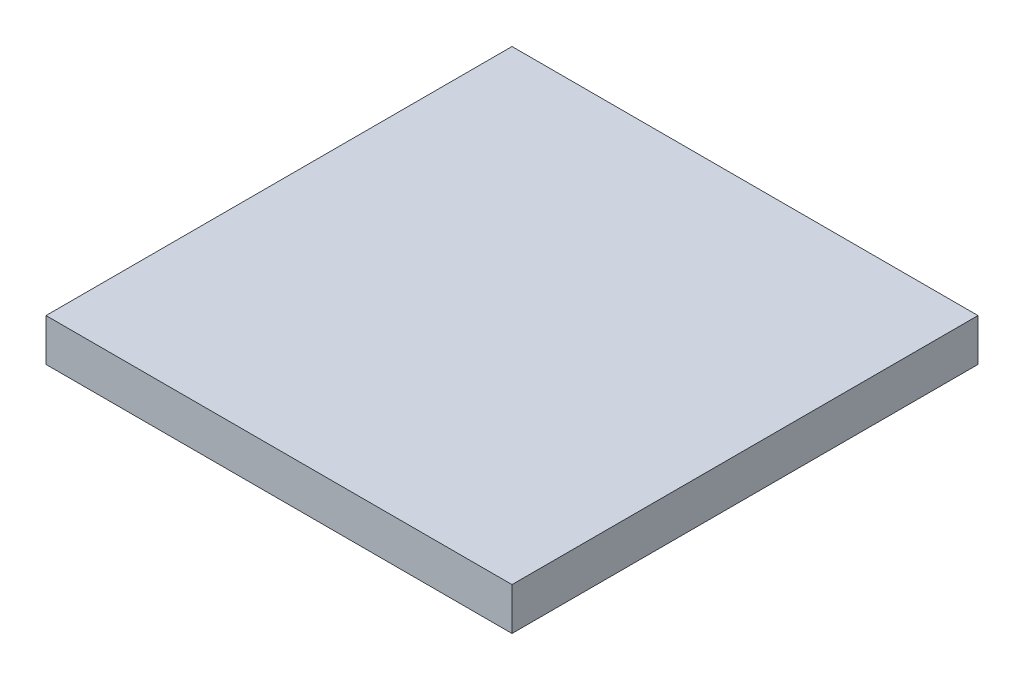
ISO-10303-21;
HEADER;
FILE_DESCRIPTION(('STEP AP214'),'2;1');
FILE_NAME('part.step','',(''),(''),'','','');
FILE_SCHEMA(('AUTOMOTIVE_DESIGN { 1 0 10303 214 1 1 1 1 }'));
ENDSEC;
DATA;
#1=APPLICATION_CONTEXT('core data for automotive mechanical design processes');
#2=APPLICATION_PROTOCOL_DEFINITION('international standard','automotive_design',2000,#1);
#3=PRODUCT_CONTEXT('',#1,'mechanical');
#4=PRODUCT('Part','Part','',(#3));
#5=PRODUCT_RELATED_PRODUCT_CATEGORY('part','',(#4));
#6=PRODUCT_DEFINITION_FORMATION('','',#4);
#7=PRODUCT_DEFINITION_CONTEXT('part definition',#1,'design');
#8=PRODUCT_DEFINITION('design','',#6,#7);
#9=PRODUCT_DEFINITION_SHAPE('','',#8);
#10=(LENGTH_UNIT() NAMED_UNIT(*) SI_UNIT(.MILLI.,.METRE.));
#11=(NAMED_UNIT(*) PLANE_ANGLE_UNIT() SI_UNIT($,.RADIAN.));
#12=(NAMED_UNIT(*) SI_UNIT($,.STERADIAN.) SOLID_ANGLE_UNIT());
#13=UNCERTAINTY_MEASURE_WITH_UNIT(LENGTH_MEASURE(1.E-05),#10,'distance_accuracy_value','');
#14=(GEOMETRIC_REPRESENTATION_CONTEXT(3) GLOBAL_UNCERTAINTY_ASSIGNED_CONTEXT((#13)) GLOBAL_UNIT_ASSIGNED_CONTEXT((#10,
#11,#12)) REPRESENTATION_CONTEXT('',''));
#15=CARTESIAN_POINT('',(0.,0.,0.));
#16=DIRECTION('',(0.,0.,1.));
#17=DIRECTION('',(1.,0.,0.));
#18=AXIS2_PLACEMENT_3D('',#15,#16,#17);
#19=CARTESIAN_POINT('',(275.,-50.,275.));
#20=DIRECTION('',(1.,0.,0.));
#21=DIRECTION('',(0.,0.,-1.));
#22=AXIS2_PLACEMENT_3D('',#19,#20,#21);
#23=PLANE('',#22);
#24=DIRECTION('',(0.,0.,-1.));
#25=VECTOR('',#24,1.);
#26=CARTESIAN_POINT('',(275.,0.,275.));
#27=LINE('',#26,#25);
#28=CARTESIAN_POINT('',(275.,0.,275.));
#29=VERTEX_POINT('',#28);
#30=CARTESIAN_POINT('',(275.,0.,-275.));
#31=VERTEX_POINT('',#30);
#32=EDGE_CURVE('E98',#29,#31,#27,.T.);
#33=ORIENTED_EDGE('',*,*,#32,.F.);
#34=DIRECTION('',(0.,1.,0.));
#35=VECTOR('',#34,1.);
#36=CARTESIAN_POINT('',(275.,-50.,275.));
#37=LINE('',#36,#35);
#38=CARTESIAN_POINT('',(275.,-50.,275.));
#39=VERTEX_POINT('',#38);
#40=EDGE_CURVE('E11',#39,#29,#37,.T.);
#41=ORIENTED_EDGE('',*,*,#40,.F.);
#42=DIRECTION('',(0.,0.,-1.));
#43=VECTOR('',#42,1.);
#44=CARTESIAN_POINT('',(275.,-50.,275.));
#45=LINE('',#44,#43);
#46=CARTESIAN_POINT('',(275.,-50.,-275.));
#47=VERTEX_POINT('',#46);
#48=EDGE_CURVE('E92',#39,#47,#45,.T.);
#49=ORIENTED_EDGE('',*,*,#48,.T.);
#50=DIRECTION('',(0.,1.,0.));
#51=VECTOR('',#50,1.);
#52=CARTESIAN_POINT('',(275.,-50.,-275.));
#53=LINE('',#52,#51);
#54=EDGE_CURVE('E37',#47,#31,#53,.T.);
#55=ORIENTED_EDGE('',*,*,#54,.T.);
#56=EDGE_LOOP('',(#33,#41,#49,#55));
#57=FACE_BOUND('',#56,.T.);
#58=ADVANCED_FACE('F34',(#57),#23,.T.);
#59=CARTESIAN_POINT('',(-275.,-50.,275.));
#60=DIRECTION('',(0.,0.,1.));
#61=DIRECTION('',(1.,0.,0.));
#62=AXIS2_PLACEMENT_3D('',#59,#60,#61);
#63=PLANE('',#62);
#64=DIRECTION('',(1.,0.,0.));
#65=VECTOR('',#64,1.);
#66=CARTESIAN_POINT('',(-275.,0.,275.));
#67=LINE('',#66,#65);
#68=CARTESIAN_POINT('',(-275.,0.,275.));
#69=VERTEX_POINT('',#68);
#70=EDGE_CURVE('E94',#69,#29,#67,.T.);
#71=ORIENTED_EDGE('',*,*,#70,.F.);
#72=DIRECTION('',(0.,1.,0.));
#73=VECTOR('',#72,1.);
#74=CARTESIAN_POINT('',(-275.,-50.,275.));
#75=LINE('',#74,#73);
#76=CARTESIAN_POINT('',(-275.,-50.,275.));
#77=VERTEX_POINT('',#76);
#78=EDGE_CURVE('E43',#77,#69,#75,.T.);
#79=ORIENTED_EDGE('',*,*,#78,.F.);
#80=DIRECTION('',(1.,0.,0.));
#81=VECTOR('',#80,1.);
#82=CARTESIAN_POINT('',(-275.,-50.,275.));
#83=LINE('',#82,#81);
#84=EDGE_CURVE('E89',#77,#39,#83,.T.);
#85=ORIENTED_EDGE('',*,*,#84,.T.);
#86=ORIENTED_EDGE('',*,*,#40,.T.);
#87=EDGE_LOOP('',(#71,#79,#85,#86));
#88=FACE_BOUND('',#87,.T.);
#89=ADVANCED_FACE('F108',(#88),#63,.T.);
#90=CARTESIAN_POINT('',(-275.,-50.,275.));
#91=DIRECTION('',(-1.,0.,0.));
#92=DIRECTION('',(0.,0.,1.));
#93=AXIS2_PLACEMENT_3D('',#90,#91,#92);
#94=PLANE('',#93);
#95=DIRECTION('',(0.,0.,1.));
#96=VECTOR('',#95,1.);
#97=CARTESIAN_POINT('',(-275.,0.,275.));
#98=LINE('',#97,#96);
#99=CARTESIAN_POINT('',(-275.,0.,-275.));
#100=VERTEX_POINT('',#99);
#101=EDGE_CURVE('E84',#100,#69,#98,.T.);
#102=ORIENTED_EDGE('',*,*,#101,.F.);
#103=DIRECTION('',(0.,1.,0.));
#104=VECTOR('',#103,1.);
#105=CARTESIAN_POINT('',(-275.,-50.,-275.));
#106=LINE('',#105,#104);
#107=CARTESIAN_POINT('',(-275.,-50.,-275.));
#108=VERTEX_POINT('',#107);
#109=EDGE_CURVE('E79',#108,#100,#106,.T.);
#110=ORIENTED_EDGE('',*,*,#109,.F.);
#111=DIRECTION('',(0.,0.,1.));
#112=VECTOR('',#111,1.);
#113=CARTESIAN_POINT('',(-275.,-50.,275.));
#114=LINE('',#113,#112);
#115=EDGE_CURVE('E82',#108,#77,#114,.T.);
#116=ORIENTED_EDGE('',*,*,#115,.T.);
#117=ORIENTED_EDGE('',*,*,#78,.T.);
#118=EDGE_LOOP('',(#102,#110,#116,#117));
#119=FACE_BOUND('',#118,.T.);
#120=ADVANCED_FACE('F81',(#119),#94,.T.);
#121=CARTESIAN_POINT('',(-275.,-50.,-275.));
#122=DIRECTION('',(0.,0.,-1.));
#123=DIRECTION('',(-1.,0.,0.));
#124=AXIS2_PLACEMENT_3D('',#121,#122,#123);
#125=PLANE('',#124);
#126=DIRECTION('',(-1.,0.,0.));
#127=VECTOR('',#126,1.);
#128=CARTESIAN_POINT('',(-275.,0.,-275.));
#129=LINE('',#128,#127);
#130=EDGE_CURVE('E101',#31,#100,#129,.T.);
#131=ORIENTED_EDGE('',*,*,#130,.F.);
#132=ORIENTED_EDGE('',*,*,#54,.F.);
#133=DIRECTION('',(-1.,0.,0.));
#134=VECTOR('',#133,1.);
#135=CARTESIAN_POINT('',(-275.,-50.,-275.));
#136=LINE('',#135,#134);
#137=EDGE_CURVE('E88',#47,#108,#136,.T.);
#138=ORIENTED_EDGE('',*,*,#137,.T.);
#139=ORIENTED_EDGE('',*,*,#109,.T.);
#140=EDGE_LOOP('',(#131,#132,#138,#139));
#141=FACE_BOUND('',#140,.T.);
#142=ADVANCED_FACE('F91',(#141),#125,.T.);
#143=CARTESIAN_POINT('',(0.,-50.,0.));
#144=DIRECTION('',(0.,-1.,0.));
#145=DIRECTION('',(0.,0.,-1.));
#146=AXIS2_PLACEMENT_3D('',#143,#144,#145);
#147=PLANE('',#146);
#148=ORIENTED_EDGE('',*,*,#48,.F.);
#149=ORIENTED_EDGE('',*,*,#84,.F.);
#150=ORIENTED_EDGE('',*,*,#115,.F.);
#151=ORIENTED_EDGE('',*,*,#137,.F.);
#152=EDGE_LOOP('',(#148,#149,#150,#151));
#153=FACE_BOUND('',#152,.T.);
#154=ADVANCED_FACE('F87',(#153),#147,.T.);
#155=CARTESIAN_POINT('',(0.,0.,0.));
#156=DIRECTION('',(0.,-1.,0.));
#157=DIRECTION('',(0.,0.,-1.));
#158=AXIS2_PLACEMENT_3D('',#155,#156,#157);
#159=PLANE('',#158);
#160=ORIENTED_EDGE('',*,*,#32,.T.);
#161=ORIENTED_EDGE('',*,*,#130,.T.);
#162=ORIENTED_EDGE('',*,*,#101,.T.);
#163=ORIENTED_EDGE('',*,*,#70,.T.);
#164=EDGE_LOOP('',(#160,#161,#162,#163));
#165=FACE_BOUND('',#164,.T.);
#166=ADVANCED_FACE('F107',(#165),#159,.F.);
#167=CLOSED_SHELL('',(#58,#89,#120,#142,#154,#166));
#168=MANIFOLD_SOLID_BREP('B2',#167);
#169=ADVANCED_BREP_SHAPE_REPRESENTATION('',(#18,#168),#14);
#170=SHAPE_DEFINITION_REPRESENTATION(#9,#169);
ENDSEC;
END-ISO-10303-21;
